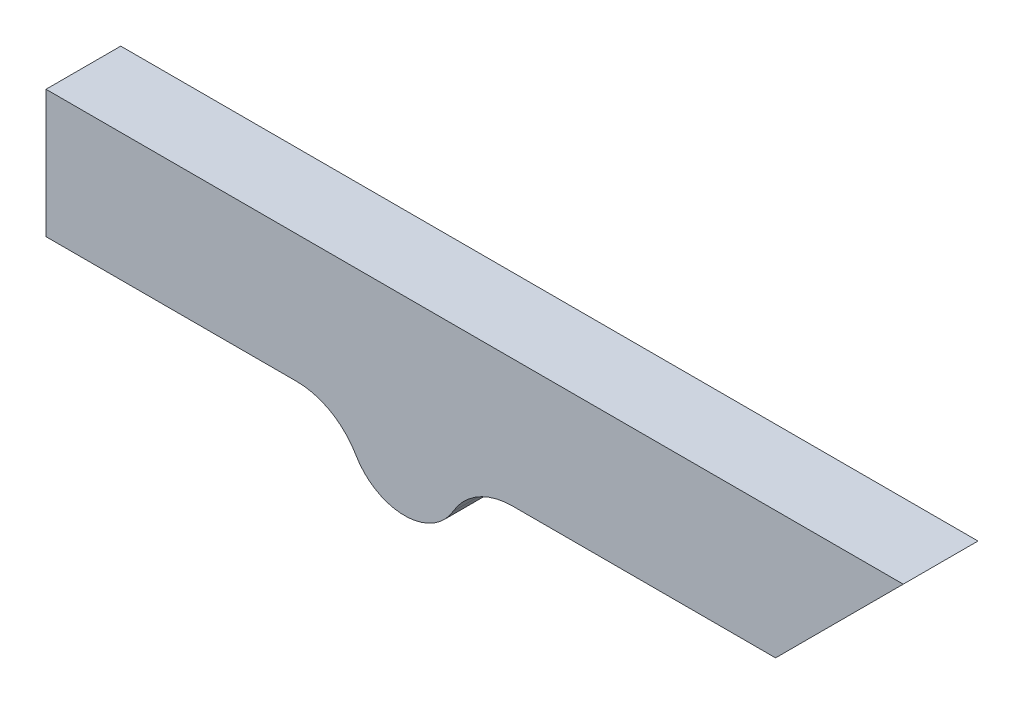
ISO-10303-21;
HEADER;
FILE_DESCRIPTION(('STEP AP214'),'2;1');
FILE_NAME('part.step','',(''),(''),'','','');
FILE_SCHEMA(('AUTOMOTIVE_DESIGN { 1 0 10303 214 1 1 1 1 }'));
ENDSEC;
DATA;
#1=APPLICATION_CONTEXT('core data for automotive mechanical design processes');
#2=APPLICATION_PROTOCOL_DEFINITION('international standard','automotive_design',2000,#1);
#3=PRODUCT_CONTEXT('',#1,'mechanical');
#4=PRODUCT('Part','Part','',(#3));
#5=PRODUCT_RELATED_PRODUCT_CATEGORY('part','',(#4));
#6=PRODUCT_DEFINITION_FORMATION('','',#4);
#7=PRODUCT_DEFINITION_CONTEXT('part definition',#1,'design');
#8=PRODUCT_DEFINITION('design','',#6,#7);
#9=PRODUCT_DEFINITION_SHAPE('','',#8);
#10=(LENGTH_UNIT() NAMED_UNIT(*) SI_UNIT(.MILLI.,.METRE.));
#11=(NAMED_UNIT(*) PLANE_ANGLE_UNIT() SI_UNIT($,.RADIAN.));
#12=(NAMED_UNIT(*) SI_UNIT($,.STERADIAN.) SOLID_ANGLE_UNIT());
#13=UNCERTAINTY_MEASURE_WITH_UNIT(LENGTH_MEASURE(1.E-05),#10,'distance_accuracy_value','');
#14=(GEOMETRIC_REPRESENTATION_CONTEXT(3) GLOBAL_UNCERTAINTY_ASSIGNED_CONTEXT((#13)) GLOBAL_UNIT_ASSIGNED_CONTEXT((#10,
#11,#12)) REPRESENTATION_CONTEXT('',''));
#15=CARTESIAN_POINT('',(0.,0.,0.));
#16=DIRECTION('',(0.,0.,1.));
#17=DIRECTION('',(1.,0.,0.));
#18=AXIS2_PLACEMENT_3D('',#15,#16,#17);
#19=CARTESIAN_POINT('',(23.3379220613579,10.61,15.2968267233094));
#20=DIRECTION('',(0.,1.,0.));
#21=DIRECTION('',(0.,0.,1.));
#22=AXIS2_PLACEMENT_3D('',#19,#20,#21);
#23=PLANE('',#22);
#24=DIRECTION('',(1.,0.,0.));
#25=VECTOR('',#24,1.);
#26=CARTESIAN_POINT('',(23.3379220613579,10.61,1.19999999999993));
#27=LINE('',#26,#25);
#28=CARTESIAN_POINT('',(19.1135118382478,10.61,1.19999999999993));
#29=VERTEX_POINT('',#28);
#30=CARTESIAN_POINT('',(23.3379220613579,10.61,1.19999999999993));
#31=VERTEX_POINT('',#30);
#32=EDGE_CURVE('E131',#29,#31,#27,.T.);
#33=ORIENTED_EDGE('',*,*,#32,.F.);
#34=DIRECTION('',(0.,0.,-1.));
#35=VECTOR('',#34,1.);
#36=CARTESIAN_POINT('',(19.1135118382478,10.61,15.2968267233094));
#37=LINE('',#36,#35);
#38=CARTESIAN_POINT('',(19.1135118382478,10.61,0.));
#39=VERTEX_POINT('',#38);
#40=EDGE_CURVE('E37',#29,#39,#37,.T.);
#41=ORIENTED_EDGE('',*,*,#40,.T.);
#42=DIRECTION('',(1.,0.,0.));
#43=VECTOR('',#42,1.);
#44=CARTESIAN_POINT('',(23.3379220613579,10.61,0.));
#45=LINE('',#44,#43);
#46=CARTESIAN_POINT('',(23.3379220613579,10.61,0.));
#47=VERTEX_POINT('',#46);
#48=EDGE_CURVE('E161',#39,#47,#45,.T.);
#49=ORIENTED_EDGE('',*,*,#48,.T.);
#50=DIRECTION('',(0.,0.,-1.));
#51=VECTOR('',#50,1.);
#52=CARTESIAN_POINT('',(23.3379220613579,10.61,15.2968267233094));
#53=LINE('',#52,#51);
#54=EDGE_CURVE('E88',#31,#47,#53,.T.);
#55=ORIENTED_EDGE('',*,*,#54,.F.);
#56=EDGE_LOOP('',(#33,#41,#49,#55));
#57=FACE_BOUND('',#56,.T.);
#58=ADVANCED_FACE('F33',(#57),#23,.F.);
#59=CARTESIAN_POINT('',(23.3379220613579,10.61,15.2968267233094));
#60=DIRECTION('',(-0.707106781186549,0.707106781186546,0.));
#61=DIRECTION('',(-0.707106781186546,-0.707106781186549,0.));
#62=AXIS2_PLACEMENT_3D('',#59,#60,#61);
#63=PLANE('',#62);
#64=DIRECTION('',(-0.707106781186548,-0.707106781186548,0.));
#65=VECTOR('',#64,1.);
#66=CARTESIAN_POINT('',(6.36396103067892,-6.36396103067892,1.19999999999993));
#67=LINE('',#66,#65);
#68=CARTESIAN_POINT('',(25.3879220613579,12.66,1.19999999999993));
#69=VERTEX_POINT('',#68);
#70=EDGE_CURVE('E95',#69,#31,#67,.T.);
#71=ORIENTED_EDGE('',*,*,#70,.T.);
#72=ORIENTED_EDGE('',*,*,#54,.T.);
#73=DIRECTION('',(0.707106781186546,0.707106781186549,0.));
#74=VECTOR('',#73,1.);
#75=CARTESIAN_POINT('',(23.3379220613579,10.61,0.));
#76=LINE('',#75,#74);
#77=CARTESIAN_POINT('',(25.3879220613579,12.66,0.));
#78=VERTEX_POINT('',#77);
#79=EDGE_CURVE('E138',#47,#78,#76,.T.);
#80=ORIENTED_EDGE('',*,*,#79,.T.);
#81=DIRECTION('',(0.,0.,-1.));
#82=VECTOR('',#81,1.);
#83=CARTESIAN_POINT('',(25.3879220613579,12.66,15.2968267233094));
#84=LINE('',#83,#82);
#85=EDGE_CURVE('E139',#69,#78,#84,.T.);
#86=ORIENTED_EDGE('',*,*,#85,.F.);
#87=EDGE_LOOP('',(#71,#72,#80,#86));
#88=FACE_BOUND('',#87,.T.);
#89=ADVANCED_FACE('F170',(#88),#63,.F.);
#90=CARTESIAN_POINT('',(11.625,12.66,15.2968267233094));
#91=DIRECTION('',(0.,-1.,0.));
#92=DIRECTION('',(0.,0.,-1.));
#93=AXIS2_PLACEMENT_3D('',#90,#91,#92);
#94=PLANE('',#93);
#95=DIRECTION('',(-1.,0.,0.));
#96=VECTOR('',#95,1.);
#97=CARTESIAN_POINT('',(11.625,12.66,1.19999999999993));
#98=LINE('',#97,#96);
#99=CARTESIAN_POINT('',(11.625,12.66,1.19999999999993));
#100=VERTEX_POINT('',#99);
#101=EDGE_CURVE('E128',#69,#100,#98,.T.);
#102=ORIENTED_EDGE('',*,*,#101,.F.);
#103=ORIENTED_EDGE('',*,*,#85,.T.);
#104=DIRECTION('',(-1.,0.,0.));
#105=VECTOR('',#104,1.);
#106=CARTESIAN_POINT('',(11.625,12.66,0.));
#107=LINE('',#106,#105);
#108=CARTESIAN_POINT('',(11.625,12.66,0.));
#109=VERTEX_POINT('',#108);
#110=EDGE_CURVE('E141',#78,#109,#107,.T.);
#111=ORIENTED_EDGE('',*,*,#110,.T.);
#112=DIRECTION('',(0.,0.,-1.));
#113=VECTOR('',#112,1.);
#114=CARTESIAN_POINT('',(11.625,12.66,15.2968267233094));
#115=LINE('',#114,#113);
#116=EDGE_CURVE('E142',#100,#109,#115,.T.);
#117=ORIENTED_EDGE('',*,*,#116,.F.);
#118=EDGE_LOOP('',(#102,#103,#111,#117));
#119=FACE_BOUND('',#118,.T.);
#120=ADVANCED_FACE('F173',(#119),#94,.F.);
#121=CARTESIAN_POINT('',(11.625,10.61,15.2968267233094));
#122=DIRECTION('',(1.,0.,0.));
#123=DIRECTION('',(0.,0.,-1.));
#124=AXIS2_PLACEMENT_3D('',#121,#122,#123);
#125=PLANE('',#124);
#126=DIRECTION('',(0.,-1.,0.));
#127=VECTOR('',#126,1.);
#128=CARTESIAN_POINT('',(11.625,10.61,1.19999999999993));
#129=LINE('',#128,#127);
#130=CARTESIAN_POINT('',(11.625,10.61,1.19999999999993));
#131=VERTEX_POINT('',#130);
#132=EDGE_CURVE('E123',#100,#131,#129,.T.);
#133=ORIENTED_EDGE('',*,*,#132,.F.);
#134=ORIENTED_EDGE('',*,*,#116,.T.);
#135=DIRECTION('',(0.,-1.,0.));
#136=VECTOR('',#135,1.);
#137=CARTESIAN_POINT('',(11.625,10.61,0.));
#138=LINE('',#137,#136);
#139=CARTESIAN_POINT('',(11.625,10.61,0.));
#140=VERTEX_POINT('',#139);
#141=EDGE_CURVE('E144',#109,#140,#138,.T.);
#142=ORIENTED_EDGE('',*,*,#141,.T.);
#143=DIRECTION('',(0.,0.,-1.));
#144=VECTOR('',#143,1.);
#145=CARTESIAN_POINT('',(11.625,10.61,15.2968267233094));
#146=LINE('',#145,#144);
#147=EDGE_CURVE('E145',#131,#140,#146,.T.);
#148=ORIENTED_EDGE('',*,*,#147,.F.);
#149=EDGE_LOOP('',(#133,#134,#142,#148));
#150=FACE_BOUND('',#149,.T.);
#151=ADVANCED_FACE('F175',(#150),#125,.F.);
#152=CARTESIAN_POINT('',(15.64941022311,10.61,15.2968267233094));
#153=DIRECTION('',(0.,1.,0.));
#154=DIRECTION('',(0.,0.,1.));
#155=AXIS2_PLACEMENT_3D('',#152,#153,#154);
#156=PLANE('',#155);
#157=DIRECTION('',(1.,0.,0.));
#158=VECTOR('',#157,1.);
#159=CARTESIAN_POINT('',(15.64941022311,10.61,1.19999999999993));
#160=LINE('',#159,#158);
#161=CARTESIAN_POINT('',(15.64941022311,10.61,1.19999999999993));
#162=VERTEX_POINT('',#161);
#163=EDGE_CURVE('E121',#131,#162,#160,.T.);
#164=ORIENTED_EDGE('',*,*,#163,.F.);
#165=ORIENTED_EDGE('',*,*,#147,.T.);
#166=DIRECTION('',(1.,0.,0.));
#167=VECTOR('',#166,1.);
#168=CARTESIAN_POINT('',(15.64941022311,10.61,0.));
#169=LINE('',#168,#167);
#170=CARTESIAN_POINT('',(15.64941022311,10.61,0.));
#171=VERTEX_POINT('',#170);
#172=EDGE_CURVE('E147',#140,#171,#169,.T.);
#173=ORIENTED_EDGE('',*,*,#172,.T.);
#174=DIRECTION('',(0.,0.,-1.));
#175=VECTOR('',#174,1.);
#176=CARTESIAN_POINT('',(15.64941022311,10.61,15.2968267233094));
#177=LINE('',#176,#175);
#178=EDGE_CURVE('E148',#162,#171,#177,.T.);
#179=ORIENTED_EDGE('',*,*,#178,.F.);
#180=EDGE_LOOP('',(#164,#165,#173,#179));
#181=FACE_BOUND('',#180,.T.);
#182=ADVANCED_FACE('F179',(#181),#156,.F.);
#183=CARTESIAN_POINT('',(15.64941022311,9.51000000000002,15.2968267233094));
#184=DIRECTION('',(0.,0.,-1.));
#185=DIRECTION('',(-1.,0.,0.));
#186=AXIS2_PLACEMENT_3D('',#183,#184,#185);
#187=CYLINDRICAL_SURFACE('',#186,1.1);
#188=CARTESIAN_POINT('',(15.64941022311,9.51000000000002,1.19999999999993));
#189=DIRECTION('',(0.,0.,1.));
#190=DIRECTION('',(1.,0.,0.));
#191=AXIS2_PLACEMENT_3D('',#188,#189,#190);
#192=CIRCLE('',#191,1.1);
#193=CARTESIAN_POINT('',(16.6020381672729,10.06,1.19999999999993));
#194=VERTEX_POINT('',#193);
#195=EDGE_CURVE('E42',#162,#194,#192,.F.);
#196=ORIENTED_EDGE('',*,*,#195,.F.);
#197=ORIENTED_EDGE('',*,*,#178,.T.);
#198=CARTESIAN_POINT('',(15.64941022311,9.51000000000002,0.));
#199=DIRECTION('',(0.,0.,-1.));
#200=DIRECTION('',(1.,0.,0.));
#201=AXIS2_PLACEMENT_3D('',#198,#199,#200);
#202=CIRCLE('',#201,1.1);
#203=CARTESIAN_POINT('',(16.6020381672729,10.06,0.));
#204=VERTEX_POINT('',#203);
#205=EDGE_CURVE('E115',#171,#204,#202,.T.);
#206=ORIENTED_EDGE('',*,*,#205,.T.);
#207=DIRECTION('',(0.,0.,-1.));
#208=VECTOR('',#207,1.);
#209=CARTESIAN_POINT('',(16.6020381672729,10.06,15.2968267233094));
#210=LINE('',#209,#208);
#211=EDGE_CURVE('E106',#194,#204,#210,.T.);
#212=ORIENTED_EDGE('',*,*,#211,.F.);
#213=EDGE_LOOP('',(#196,#197,#206,#212));
#214=FACE_BOUND('',#213,.T.);
#215=ADVANCED_FACE('F112',(#214),#187,.F.);
#216=CARTESIAN_POINT('',(17.3814610306789,10.51,15.2968267233094));
#217=DIRECTION('',(0.,0.,-1.));
#218=DIRECTION('',(-1.,0.,0.));
#219=AXIS2_PLACEMENT_3D('',#216,#217,#218);
#220=CYLINDRICAL_SURFACE('',#219,0.900000000000002);
#221=CARTESIAN_POINT('',(17.3814610306789,10.51,1.19999999999993));
#222=DIRECTION('',(0.,0.,1.));
#223=DIRECTION('',(1.,0.,0.));
#224=AXIS2_PLACEMENT_3D('',#221,#222,#223);
#225=CIRCLE('',#224,0.900000000000002);
#226=CARTESIAN_POINT('',(18.1608838940849,10.06,1.19999999999993));
#227=VERTEX_POINT('',#226);
#228=EDGE_CURVE('E11',#194,#227,#225,.T.);
#229=ORIENTED_EDGE('',*,*,#228,.F.);
#230=ORIENTED_EDGE('',*,*,#211,.T.);
#231=CARTESIAN_POINT('',(17.3814610306789,10.51,0.));
#232=DIRECTION('',(0.,0.,1.));
#233=DIRECTION('',(1.,0.,0.));
#234=AXIS2_PLACEMENT_3D('',#231,#232,#233);
#235=CIRCLE('',#234,0.900000000000002);
#236=CARTESIAN_POINT('',(18.1608838940849,10.06,0.));
#237=VERTEX_POINT('',#236);
#238=EDGE_CURVE('E117',#204,#237,#235,.T.);
#239=ORIENTED_EDGE('',*,*,#238,.T.);
#240=DIRECTION('',(0.,0.,-1.));
#241=VECTOR('',#240,1.);
#242=CARTESIAN_POINT('',(18.1608838940849,10.06,15.2968267233094));
#243=LINE('',#242,#241);
#244=EDGE_CURVE('E55',#227,#237,#243,.T.);
#245=ORIENTED_EDGE('',*,*,#244,.F.);
#246=EDGE_LOOP('',(#229,#230,#239,#245));
#247=FACE_BOUND('',#246,.T.);
#248=ADVANCED_FACE('F105',(#247),#220,.T.);
#249=CARTESIAN_POINT('',(19.1135118382478,9.51000000000002,15.2968267233094));
#250=DIRECTION('',(0.,0.,-1.));
#251=DIRECTION('',(-1.,0.,0.));
#252=AXIS2_PLACEMENT_3D('',#249,#250,#251);
#253=CYLINDRICAL_SURFACE('',#252,1.1);
#254=CARTESIAN_POINT('',(19.1135118382478,9.51000000000002,1.19999999999993));
#255=DIRECTION('',(0.,0.,1.));
#256=DIRECTION('',(1.,0.,0.));
#257=AXIS2_PLACEMENT_3D('',#254,#255,#256);
#258=CIRCLE('',#257,1.1);
#259=EDGE_CURVE('E134',#227,#29,#258,.F.);
#260=ORIENTED_EDGE('',*,*,#259,.F.);
#261=ORIENTED_EDGE('',*,*,#244,.T.);
#262=CARTESIAN_POINT('',(19.1135118382478,9.51000000000002,0.));
#263=DIRECTION('',(0.,0.,-1.));
#264=DIRECTION('',(1.,0.,0.));
#265=AXIS2_PLACEMENT_3D('',#262,#263,#264);
#266=CIRCLE('',#265,1.1);
#267=EDGE_CURVE('E136',#237,#39,#266,.T.);
#268=ORIENTED_EDGE('',*,*,#267,.T.);
#269=ORIENTED_EDGE('',*,*,#40,.F.);
#270=EDGE_LOOP('',(#260,#261,#268,#269));
#271=FACE_BOUND('',#270,.T.);
#272=ADVANCED_FACE('F165',(#271),#253,.F.);
#273=CARTESIAN_POINT('',(19.1135118382478,9.51000000000002,0.));
#274=DIRECTION('',(0.,0.,1.));
#275=DIRECTION('',(1.,0.,0.));
#276=AXIS2_PLACEMENT_3D('',#273,#274,#275);
#277=PLANE('',#276);
#278=ORIENTED_EDGE('',*,*,#48,.F.);
#279=ORIENTED_EDGE('',*,*,#267,.F.);
#280=ORIENTED_EDGE('',*,*,#238,.F.);
#281=ORIENTED_EDGE('',*,*,#205,.F.);
#282=ORIENTED_EDGE('',*,*,#172,.F.);
#283=ORIENTED_EDGE('',*,*,#141,.F.);
#284=ORIENTED_EDGE('',*,*,#110,.F.);
#285=ORIENTED_EDGE('',*,*,#79,.F.);
#286=EDGE_LOOP('',(#278,#279,#280,#281,#282,#283,#284,#285));
#287=FACE_BOUND('',#286,.T.);
#288=ADVANCED_FACE('F167',(#287),#277,.F.);
#289=CARTESIAN_POINT('',(0.,0.,1.19999999999993));
#290=DIRECTION('',(0.,0.,1.));
#291=DIRECTION('',(1.,0.,0.));
#292=AXIS2_PLACEMENT_3D('',#289,#290,#291);
#293=PLANE('',#292);
#294=ORIENTED_EDGE('',*,*,#259,.T.);
#295=ORIENTED_EDGE('',*,*,#32,.T.);
#296=ORIENTED_EDGE('',*,*,#70,.F.);
#297=ORIENTED_EDGE('',*,*,#101,.T.);
#298=ORIENTED_EDGE('',*,*,#132,.T.);
#299=ORIENTED_EDGE('',*,*,#163,.T.);
#300=ORIENTED_EDGE('',*,*,#195,.T.);
#301=ORIENTED_EDGE('',*,*,#228,.T.);
#302=EDGE_LOOP('',(#294,#295,#296,#297,#298,#299,#300,#301));
#303=FACE_BOUND('',#302,.T.);
#304=ADVANCED_FACE('F35',(#303),#293,.T.);
#305=CLOSED_SHELL('',(#58,#89,#120,#151,#182,#215,#248,#272,#288,#304));
#306=MANIFOLD_SOLID_BREP('B2',#305);
#307=ADVANCED_BREP_SHAPE_REPRESENTATION('',(#18,#306),#14);
#308=SHAPE_DEFINITION_REPRESENTATION(#9,#307);
ENDSEC;
END-ISO-10303-21;
